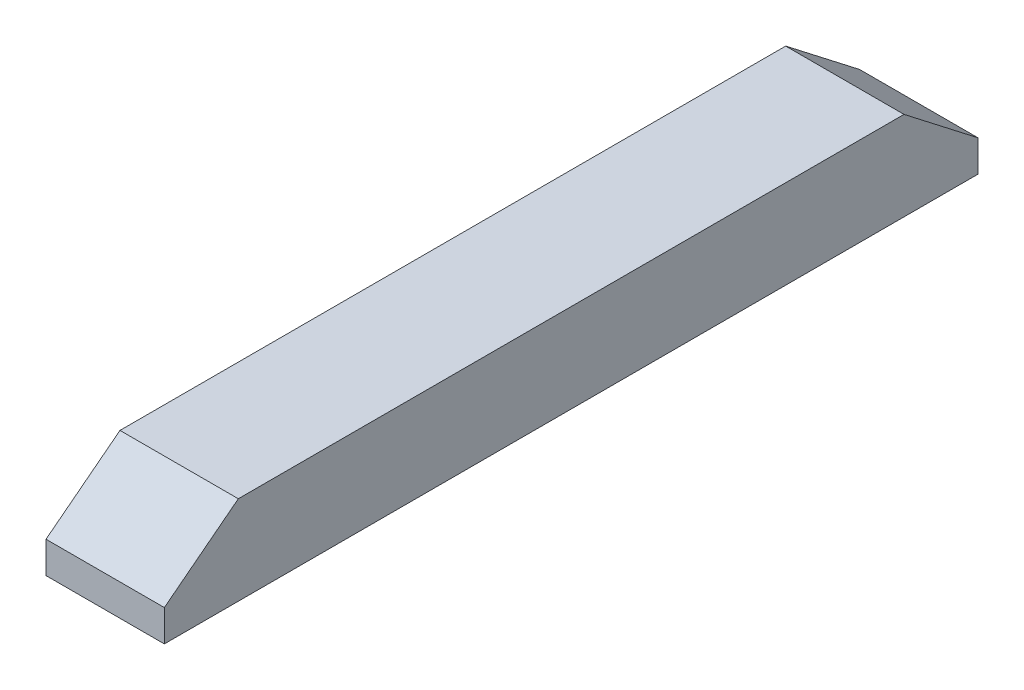
ISO-10303-21;
HEADER;
FILE_DESCRIPTION(('STEP AP214'),'2;1');
FILE_NAME('part.step','',(''),(''),'','','');
FILE_SCHEMA(('AUTOMOTIVE_DESIGN { 1 0 10303 214 1 1 1 1 }'));
ENDSEC;
DATA;
#1=APPLICATION_CONTEXT('core data for automotive mechanical design processes');
#2=APPLICATION_PROTOCOL_DEFINITION('international standard','automotive_design',2000,#1);
#3=PRODUCT_CONTEXT('',#1,'mechanical');
#4=PRODUCT('Part','Part','',(#3));
#5=PRODUCT_RELATED_PRODUCT_CATEGORY('part','',(#4));
#6=PRODUCT_DEFINITION_FORMATION('','',#4);
#7=PRODUCT_DEFINITION_CONTEXT('part definition',#1,'design');
#8=PRODUCT_DEFINITION('design','',#6,#7);
#9=PRODUCT_DEFINITION_SHAPE('','',#8);
#10=(LENGTH_UNIT() NAMED_UNIT(*) SI_UNIT(.MILLI.,.METRE.));
#11=(NAMED_UNIT(*) PLANE_ANGLE_UNIT() SI_UNIT($,.RADIAN.));
#12=(NAMED_UNIT(*) SI_UNIT($,.STERADIAN.) SOLID_ANGLE_UNIT());
#13=UNCERTAINTY_MEASURE_WITH_UNIT(LENGTH_MEASURE(1.E-05),#10,'distance_accuracy_value','');
#14=(GEOMETRIC_REPRESENTATION_CONTEXT(3) GLOBAL_UNCERTAINTY_ASSIGNED_CONTEXT((#13)) GLOBAL_UNIT_ASSIGNED_CONTEXT((#10,
#11,#12)) REPRESENTATION_CONTEXT('',''));
#15=CARTESIAN_POINT('',(0.,0.,0.));
#16=DIRECTION('',(0.,0.,1.));
#17=DIRECTION('',(1.,0.,0.));
#18=AXIS2_PLACEMENT_3D('',#15,#16,#17);
#19=CARTESIAN_POINT('',(40.,30.,550.));
#20=DIRECTION('',(-1.,0.,0.));
#21=DIRECTION('',(0.,0.,1.));
#22=AXIS2_PLACEMENT_3D('',#19,#20,#21);
#23=PLANE('',#22);
#24=DIRECTION('',(0.,0.,-1.));
#25=VECTOR('',#24,1.);
#26=CARTESIAN_POINT('',(40.,30.,550.));
#27=LINE('',#26,#25);
#28=CARTESIAN_POINT('',(40.,30.,500.));
#29=VERTEX_POINT('',#28);
#30=CARTESIAN_POINT('',(40.,30.,50.));
#31=VERTEX_POINT('',#30);
#32=EDGE_CURVE('E11',#29,#31,#27,.T.);
#33=ORIENTED_EDGE('',*,*,#32,.F.);
#34=DIRECTION('',(0.,0.612071851188206,-0.790802155398582));
#35=VECTOR('',#34,1.);
#36=CARTESIAN_POINT('',(40.,-8.69942987697777,550.));
#37=LINE('',#36,#35);
#38=CARTESIAN_POINT('',(40.,-8.69942987697777,550.));
#39=VERTEX_POINT('',#38);
#40=EDGE_CURVE('E99',#39,#29,#37,.T.);
#41=ORIENTED_EDGE('',*,*,#40,.F.);
#42=DIRECTION('',(0.,1.,0.));
#43=VECTOR('',#42,1.);
#44=CARTESIAN_POINT('',(40.,30.,550.));
#45=LINE('',#44,#43);
#46=CARTESIAN_POINT('',(40.,-30.,550.));
#47=VERTEX_POINT('',#46);
#48=EDGE_CURVE('E133',#47,#39,#45,.T.);
#49=ORIENTED_EDGE('',*,*,#48,.F.);
#50=DIRECTION('',(0.,0.,-1.));
#51=VECTOR('',#50,1.);
#52=CARTESIAN_POINT('',(40.,-30.,550.));
#53=LINE('',#52,#51);
#54=CARTESIAN_POINT('',(40.,-30.,0.));
#55=VERTEX_POINT('',#54);
#56=EDGE_CURVE('E123',#47,#55,#53,.T.);
#57=ORIENTED_EDGE('',*,*,#56,.T.);
#58=DIRECTION('',(0.,1.,0.));
#59=VECTOR('',#58,1.);
#60=CARTESIAN_POINT('',(40.,30.,0.));
#61=LINE('',#60,#59);
#62=CARTESIAN_POINT('',(40.,-8.69942987697777,0.));
#63=VERTEX_POINT('',#62);
#64=EDGE_CURVE('E104',#55,#63,#61,.T.);
#65=ORIENTED_EDGE('',*,*,#64,.T.);
#66=DIRECTION('',(0.,-0.612071851188206,-0.790802155398582));
#67=VECTOR('',#66,1.);
#68=CARTESIAN_POINT('',(40.,30.,50.));
#69=LINE('',#68,#67);
#70=EDGE_CURVE('E68',#31,#63,#69,.T.);
#71=ORIENTED_EDGE('',*,*,#70,.F.);
#72=EDGE_LOOP('',(#33,#41,#49,#57,#65,#71));
#73=FACE_BOUND('',#72,.T.);
#74=ADVANCED_FACE('F45',(#73),#23,.F.);
#75=CARTESIAN_POINT('',(-40.,30.,550.));
#76=DIRECTION('',(0.,-1.,0.));
#77=DIRECTION('',(0.,0.,-1.));
#78=AXIS2_PLACEMENT_3D('',#75,#76,#77);
#79=PLANE('',#78);
#80=DIRECTION('',(0.,0.,-1.));
#81=VECTOR('',#80,1.);
#82=CARTESIAN_POINT('',(-40.,30.,550.));
#83=LINE('',#82,#81);
#84=CARTESIAN_POINT('',(-40.,30.,500.));
#85=VERTEX_POINT('',#84);
#86=CARTESIAN_POINT('',(-40.,30.,50.));
#87=VERTEX_POINT('',#86);
#88=EDGE_CURVE('E53',#85,#87,#83,.T.);
#89=ORIENTED_EDGE('',*,*,#88,.F.);
#90=DIRECTION('',(1.,0.,0.));
#91=VECTOR('',#90,1.);
#92=CARTESIAN_POINT('',(-40.,30.,500.));
#93=LINE('',#92,#91);
#94=EDGE_CURVE('E96',#85,#29,#93,.T.);
#95=ORIENTED_EDGE('',*,*,#94,.T.);
#96=ORIENTED_EDGE('',*,*,#32,.T.);
#97=DIRECTION('',(1.,0.,0.));
#98=VECTOR('',#97,1.);
#99=CARTESIAN_POINT('',(-40.,30.,50.));
#100=LINE('',#99,#98);
#101=EDGE_CURVE('E118',#87,#31,#100,.T.);
#102=ORIENTED_EDGE('',*,*,#101,.F.);
#103=EDGE_LOOP('',(#89,#95,#96,#102));
#104=FACE_BOUND('',#103,.T.);
#105=ADVANCED_FACE('F117',(#104),#79,.F.);
#106=CARTESIAN_POINT('',(-40.,30.,550.));
#107=DIRECTION('',(1.,0.,0.));
#108=DIRECTION('',(0.,1.,0.));
#109=AXIS2_PLACEMENT_3D('',#106,#107,#108);
#110=PLANE('',#109);
#111=DIRECTION('',(0.,-1.,0.));
#112=VECTOR('',#111,1.);
#113=CARTESIAN_POINT('',(-40.,30.,550.));
#114=LINE('',#113,#112);
#115=CARTESIAN_POINT('',(-40.,-8.69942987697777,550.));
#116=VERTEX_POINT('',#115);
#117=CARTESIAN_POINT('',(-40.,-30.,550.));
#118=VERTEX_POINT('',#117);
#119=EDGE_CURVE('E113',#116,#118,#114,.T.);
#120=ORIENTED_EDGE('',*,*,#119,.F.);
#121=DIRECTION('',(0.,0.612071851188206,-0.790802155398582));
#122=VECTOR('',#121,1.);
#123=CARTESIAN_POINT('',(-40.,-8.69942987697777,550.));
#124=LINE('',#123,#122);
#125=EDGE_CURVE('E60',#116,#85,#124,.T.);
#126=ORIENTED_EDGE('',*,*,#125,.T.);
#127=ORIENTED_EDGE('',*,*,#88,.T.);
#128=DIRECTION('',(0.,-0.612071851188206,-0.790802155398582));
#129=VECTOR('',#128,1.);
#130=CARTESIAN_POINT('',(-40.,30.,50.));
#131=LINE('',#130,#129);
#132=CARTESIAN_POINT('',(-40.,-8.69942987697777,0.));
#133=VERTEX_POINT('',#132);
#134=EDGE_CURVE('E147',#87,#133,#131,.T.);
#135=ORIENTED_EDGE('',*,*,#134,.T.);
#136=DIRECTION('',(0.,-1.,0.));
#137=VECTOR('',#136,1.);
#138=CARTESIAN_POINT('',(-40.,30.,0.));
#139=LINE('',#138,#137);
#140=CARTESIAN_POINT('',(-40.,-30.,0.));
#141=VERTEX_POINT('',#140);
#142=EDGE_CURVE('E134',#133,#141,#139,.T.);
#143=ORIENTED_EDGE('',*,*,#142,.T.);
#144=DIRECTION('',(0.,0.,-1.));
#145=VECTOR('',#144,1.);
#146=CARTESIAN_POINT('',(-40.,-30.,550.));
#147=LINE('',#146,#145);
#148=EDGE_CURVE('E120',#118,#141,#147,.T.);
#149=ORIENTED_EDGE('',*,*,#148,.F.);
#150=EDGE_LOOP('',(#120,#126,#127,#135,#143,#149));
#151=FACE_BOUND('',#150,.T.);
#152=ADVANCED_FACE('F110',(#151),#110,.F.);
#153=CARTESIAN_POINT('',(-40.,-30.,550.));
#154=DIRECTION('',(0.,1.,0.));
#155=DIRECTION('',(0.,0.,1.));
#156=AXIS2_PLACEMENT_3D('',#153,#154,#155);
#157=PLANE('',#156);
#158=DIRECTION('',(1.,0.,0.));
#159=VECTOR('',#158,1.);
#160=CARTESIAN_POINT('',(-40.,-30.,0.));
#161=LINE('',#160,#159);
#162=EDGE_CURVE('E130',#141,#55,#161,.T.);
#163=ORIENTED_EDGE('',*,*,#162,.T.);
#164=ORIENTED_EDGE('',*,*,#56,.F.);
#165=DIRECTION('',(1.,0.,0.));
#166=VECTOR('',#165,1.);
#167=CARTESIAN_POINT('',(-40.,-30.,550.));
#168=LINE('',#167,#166);
#169=EDGE_CURVE('E129',#118,#47,#168,.T.);
#170=ORIENTED_EDGE('',*,*,#169,.F.);
#171=ORIENTED_EDGE('',*,*,#148,.T.);
#172=EDGE_LOOP('',(#163,#164,#170,#171));
#173=FACE_BOUND('',#172,.T.);
#174=ADVANCED_FACE('F167',(#173),#157,.F.);
#175=CARTESIAN_POINT('',(0.,0.,550.));
#176=DIRECTION('',(0.,0.,1.));
#177=DIRECTION('',(1.,0.,0.));
#178=AXIS2_PLACEMENT_3D('',#175,#176,#177);
#179=PLANE('',#178);
#180=DIRECTION('',(1.,0.,0.));
#181=VECTOR('',#180,1.);
#182=CARTESIAN_POINT('',(-40.,-8.69942987697777,550.));
#183=LINE('',#182,#181);
#184=EDGE_CURVE('E105',#116,#39,#183,.T.);
#185=ORIENTED_EDGE('',*,*,#184,.F.);
#186=ORIENTED_EDGE('',*,*,#119,.T.);
#187=ORIENTED_EDGE('',*,*,#169,.T.);
#188=ORIENTED_EDGE('',*,*,#48,.T.);
#189=EDGE_LOOP('',(#185,#186,#187,#188));
#190=FACE_BOUND('',#189,.T.);
#191=ADVANCED_FACE('F163',(#190),#179,.T.);
#192=CARTESIAN_POINT('',(0.,0.,0.));
#193=DIRECTION('',(0.,0.,1.));
#194=DIRECTION('',(1.,0.,0.));
#195=AXIS2_PLACEMENT_3D('',#192,#193,#194);
#196=PLANE('',#195);
#197=ORIENTED_EDGE('',*,*,#142,.F.);
#198=DIRECTION('',(1.,0.,0.));
#199=VECTOR('',#198,1.);
#200=CARTESIAN_POINT('',(-40.,-8.69942987697777,0.));
#201=LINE('',#200,#199);
#202=EDGE_CURVE('E152',#133,#63,#201,.T.);
#203=ORIENTED_EDGE('',*,*,#202,.T.);
#204=ORIENTED_EDGE('',*,*,#64,.F.);
#205=ORIENTED_EDGE('',*,*,#162,.F.);
#206=EDGE_LOOP('',(#197,#203,#204,#205));
#207=FACE_BOUND('',#206,.T.);
#208=ADVANCED_FACE('F172',(#207),#196,.F.);
#209=CARTESIAN_POINT('',(-40.,30.,50.));
#210=DIRECTION('',(0.,-0.790802155398582,0.612071851188206));
#211=DIRECTION('',(0.,-0.612071851188206,-0.790802155398582));
#212=AXIS2_PLACEMENT_3D('',#209,#210,#211);
#213=PLANE('',#212);
#214=ORIENTED_EDGE('',*,*,#70,.T.);
#215=ORIENTED_EDGE('',*,*,#202,.F.);
#216=ORIENTED_EDGE('',*,*,#134,.F.);
#217=ORIENTED_EDGE('',*,*,#101,.T.);
#218=EDGE_LOOP('',(#214,#215,#216,#217));
#219=FACE_BOUND('',#218,.T.);
#220=ADVANCED_FACE('F173',(#219),#213,.F.);
#221=CARTESIAN_POINT('',(-40.,-8.69942987697777,550.));
#222=DIRECTION('',(0.,-0.790802155398582,-0.612071851188206));
#223=DIRECTION('',(0.,0.612071851188206,-0.790802155398582));
#224=AXIS2_PLACEMENT_3D('',#221,#222,#223);
#225=PLANE('',#224);
#226=ORIENTED_EDGE('',*,*,#40,.T.);
#227=ORIENTED_EDGE('',*,*,#94,.F.);
#228=ORIENTED_EDGE('',*,*,#125,.F.);
#229=ORIENTED_EDGE('',*,*,#184,.T.);
#230=EDGE_LOOP('',(#226,#227,#228,#229));
#231=FACE_BOUND('',#230,.T.);
#232=ADVANCED_FACE('F97',(#231),#225,.F.);
#233=CLOSED_SHELL('',(#74,#105,#152,#174,#191,#208,#220,#232));
#234=MANIFOLD_SOLID_BREP('B2',#233);
#235=ADVANCED_BREP_SHAPE_REPRESENTATION('',(#18,#234),#14);
#236=SHAPE_DEFINITION_REPRESENTATION(#9,#235);
ENDSEC;
END-ISO-10303-21;
